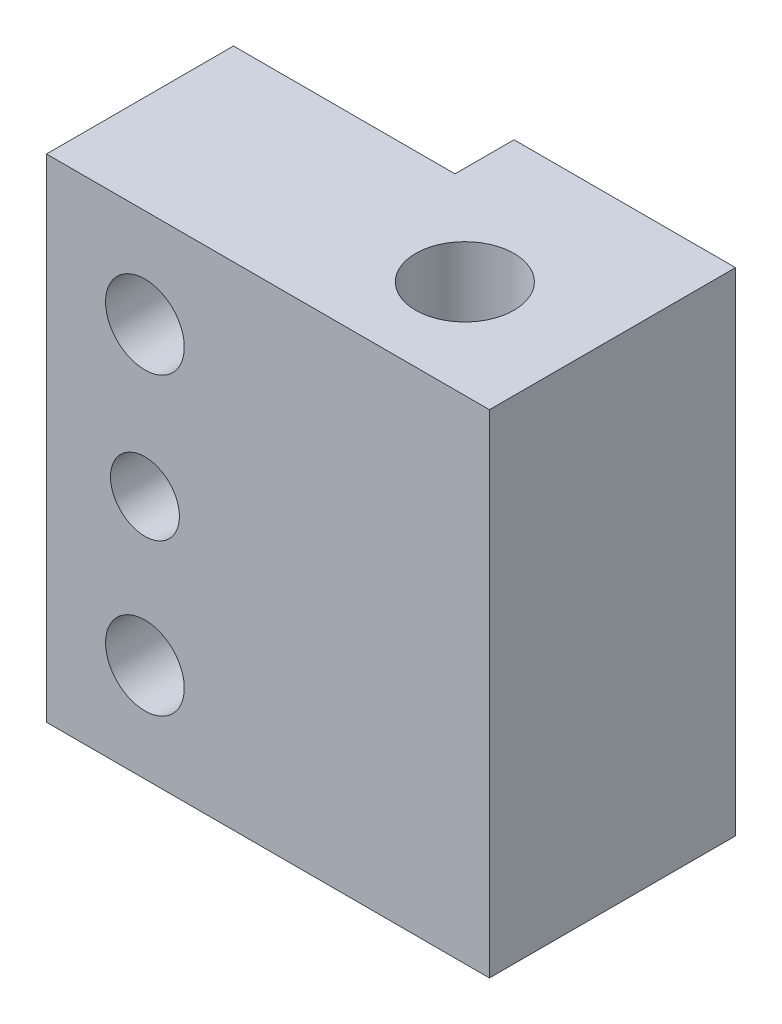
ISO-10303-21;
HEADER;
FILE_DESCRIPTION(('STEP AP214'),'2;1');
FILE_NAME('part.step','',(''),(''),'','','');
FILE_SCHEMA(('AUTOMOTIVE_DESIGN { 1 0 10303 214 1 1 1 1 }'));
ENDSEC;
DATA;
#1=APPLICATION_CONTEXT('core data for automotive mechanical design processes');
#2=APPLICATION_PROTOCOL_DEFINITION('international standard','automotive_design',2000,#1);
#3=PRODUCT_CONTEXT('',#1,'mechanical');
#4=PRODUCT('Part','Part','',(#3));
#5=PRODUCT_RELATED_PRODUCT_CATEGORY('part','',(#4));
#6=PRODUCT_DEFINITION_FORMATION('','',#4);
#7=PRODUCT_DEFINITION_CONTEXT('part definition',#1,'design');
#8=PRODUCT_DEFINITION('design','',#6,#7);
#9=PRODUCT_DEFINITION_SHAPE('','',#8);
#10=(LENGTH_UNIT() NAMED_UNIT(*) SI_UNIT(.MILLI.,.METRE.));
#11=(NAMED_UNIT(*) PLANE_ANGLE_UNIT() SI_UNIT($,.RADIAN.));
#12=(NAMED_UNIT(*) SI_UNIT($,.STERADIAN.) SOLID_ANGLE_UNIT());
#13=UNCERTAINTY_MEASURE_WITH_UNIT(LENGTH_MEASURE(1.E-05),#10,'distance_accuracy_value','');
#14=(GEOMETRIC_REPRESENTATION_CONTEXT(3) GLOBAL_UNCERTAINTY_ASSIGNED_CONTEXT((#13)) GLOBAL_UNIT_ASSIGNED_CONTEXT((#10,
#11,#12)) REPRESENTATION_CONTEXT('',''));
#15=CARTESIAN_POINT('',(0.,0.,0.));
#16=DIRECTION('',(0.,0.,1.));
#17=DIRECTION('',(1.,0.,0.));
#18=AXIS2_PLACEMENT_3D('',#15,#16,#17);
#19=CARTESIAN_POINT('',(0.,10.,0.));
#20=DIRECTION('',(0.,1.,0.));
#21=DIRECTION('',(0.,0.,1.));
#22=AXIS2_PLACEMENT_3D('',#19,#20,#21);
#23=PLANE('',#22);
#24=DIRECTION('',(0.,0.,-1.));
#25=VECTOR('',#24,1.);
#26=CARTESIAN_POINT('',(11.,10.,0.));
#27=LINE('',#26,#25);
#28=CARTESIAN_POINT('',(11.,10.,0.));
#29=VERTEX_POINT('',#28);
#30=CARTESIAN_POINT('',(11.,10.,-3.8));
#31=VERTEX_POINT('',#30);
#32=EDGE_CURVE('E48',#29,#31,#27,.T.);
#33=ORIENTED_EDGE('',*,*,#32,.F.);
#34=DIRECTION('',(1.,0.,0.));
#35=VECTOR('',#34,1.);
#36=CARTESIAN_POINT('',(0.,10.,0.));
#37=LINE('',#36,#35);
#38=CARTESIAN_POINT('',(20.,10.,0.));
#39=VERTEX_POINT('',#38);
#40=EDGE_CURVE('E84',#29,#39,#37,.T.);
#41=ORIENTED_EDGE('',*,*,#40,.T.);
#42=DIRECTION('',(0.,0.,-1.));
#43=VECTOR('',#42,1.);
#44=CARTESIAN_POINT('',(20.,10.,0.));
#45=LINE('',#44,#43);
#46=CARTESIAN_POINT('',(20.,10.,-5.));
#47=VERTEX_POINT('',#46);
#48=EDGE_CURVE('E114',#39,#47,#45,.T.);
#49=ORIENTED_EDGE('',*,*,#48,.T.);
#50=DIRECTION('',(-1.,0.,0.));
#51=VECTOR('',#50,1.);
#52=CARTESIAN_POINT('',(20.,10.,-5.));
#53=LINE('',#52,#51);
#54=CARTESIAN_POINT('',(15.5,10.,-5.));
#55=VERTEX_POINT('',#54);
#56=EDGE_CURVE('E130',#47,#55,#53,.T.);
#57=ORIENTED_EDGE('',*,*,#56,.T.);
#58=DIRECTION('',(0.,0.,1.));
#59=VECTOR('',#58,1.);
#60=CARTESIAN_POINT('',(15.5,10.,-5.));
#61=LINE('',#60,#59);
#62=CARTESIAN_POINT('',(15.5,10.,-3.8));
#63=VERTEX_POINT('',#62);
#64=EDGE_CURVE('E57',#55,#63,#61,.T.);
#65=ORIENTED_EDGE('',*,*,#64,.T.);
#66=DIRECTION('',(-1.,0.,0.));
#67=VECTOR('',#66,1.);
#68=CARTESIAN_POINT('',(0.,10.,-3.8));
#69=LINE('',#68,#67);
#70=EDGE_CURVE('E122',#63,#31,#69,.T.);
#71=ORIENTED_EDGE('',*,*,#70,.T.);
#72=EDGE_LOOP('',(#33,#41,#49,#57,#65,#71));
#73=FACE_BOUND('',#72,.T.);
#74=CARTESIAN_POINT('',(17.5,10.,-2.));
#75=DIRECTION('',(0.,1.,0.));
#76=DIRECTION('',(0.,0.,1.));
#77=AXIS2_PLACEMENT_3D('',#74,#75,#76);
#78=CIRCLE('',#77,1.);
#79=CARTESIAN_POINT('',(17.5,10.,-0.999999999999999));
#80=VERTEX_POINT('',#79);
#81=EDGE_CURVE('E137',#80,#80,#78,.T.);
#82=ORIENTED_EDGE('',*,*,#81,.F.);
#83=EDGE_LOOP('',(#82));
#84=FACE_BOUND('',#83,.T.);
#85=ADVANCED_FACE('F33',(#73,#84),#23,.T.);
#86=CARTESIAN_POINT('',(0.,0.,0.));
#87=DIRECTION('',(0.,1.,0.));
#88=DIRECTION('',(0.,0.,1.));
#89=AXIS2_PLACEMENT_3D('',#86,#87,#88);
#90=PLANE('',#89);
#91=DIRECTION('',(1.,0.,0.));
#92=VECTOR('',#91,1.);
#93=CARTESIAN_POINT('',(0.,0.,0.));
#94=LINE('',#93,#92);
#95=CARTESIAN_POINT('',(11.,0.,0.));
#96=VERTEX_POINT('',#95);
#97=CARTESIAN_POINT('',(20.,0.,0.));
#98=VERTEX_POINT('',#97);
#99=EDGE_CURVE('E109',#96,#98,#94,.T.);
#100=ORIENTED_EDGE('',*,*,#99,.F.);
#101=DIRECTION('',(0.,0.,-1.));
#102=VECTOR('',#101,1.);
#103=CARTESIAN_POINT('',(11.,0.,0.));
#104=LINE('',#103,#102);
#105=CARTESIAN_POINT('',(11.,0.,-3.8));
#106=VERTEX_POINT('',#105);
#107=EDGE_CURVE('E95',#96,#106,#104,.T.);
#108=ORIENTED_EDGE('',*,*,#107,.T.);
#109=DIRECTION('',(-1.,0.,0.));
#110=VECTOR('',#109,1.);
#111=CARTESIAN_POINT('',(0.,0.,-3.8));
#112=LINE('',#111,#110);
#113=CARTESIAN_POINT('',(15.5,0.,-3.8));
#114=VERTEX_POINT('',#113);
#115=EDGE_CURVE('E107',#114,#106,#112,.T.);
#116=ORIENTED_EDGE('',*,*,#115,.F.);
#117=DIRECTION('',(0.,0.,1.));
#118=VECTOR('',#117,1.);
#119=CARTESIAN_POINT('',(15.5,0.,-5.));
#120=LINE('',#119,#118);
#121=CARTESIAN_POINT('',(15.5,0.,-5.));
#122=VERTEX_POINT('',#121);
#123=EDGE_CURVE('E78',#122,#114,#120,.T.);
#124=ORIENTED_EDGE('',*,*,#123,.F.);
#125=DIRECTION('',(-1.,0.,0.));
#126=VECTOR('',#125,1.);
#127=CARTESIAN_POINT('',(20.,0.,-5.));
#128=LINE('',#127,#126);
#129=CARTESIAN_POINT('',(20.,0.,-5.));
#130=VERTEX_POINT('',#129);
#131=EDGE_CURVE('E116',#130,#122,#128,.T.);
#132=ORIENTED_EDGE('',*,*,#131,.F.);
#133=DIRECTION('',(0.,0.,-1.));
#134=VECTOR('',#133,1.);
#135=CARTESIAN_POINT('',(20.,0.,0.));
#136=LINE('',#135,#134);
#137=EDGE_CURVE('E133',#98,#130,#136,.T.);
#138=ORIENTED_EDGE('',*,*,#137,.F.);
#139=EDGE_LOOP('',(#100,#108,#116,#124,#132,#138));
#140=FACE_BOUND('',#139,.T.);
#141=CARTESIAN_POINT('',(17.5,0.,-2.));
#142=DIRECTION('',(0.,1.,0.));
#143=DIRECTION('',(0.,0.,1.));
#144=AXIS2_PLACEMENT_3D('',#141,#142,#143);
#145=CIRCLE('',#144,1.);
#146=CARTESIAN_POINT('',(17.5,0.,-0.999999999999999));
#147=VERTEX_POINT('',#146);
#148=EDGE_CURVE('E142',#147,#147,#145,.T.);
#149=ORIENTED_EDGE('',*,*,#148,.T.);
#150=EDGE_LOOP('',(#149));
#151=FACE_BOUND('',#150,.T.);
#152=ADVANCED_FACE('F105',(#140,#151),#90,.F.);
#153=CARTESIAN_POINT('',(0.,10.,0.));
#154=DIRECTION('',(0.,0.,-1.));
#155=DIRECTION('',(-1.,0.,0.));
#156=AXIS2_PLACEMENT_3D('',#153,#154,#155);
#157=PLANE('',#156);
#158=CARTESIAN_POINT('',(13.,2.,0.));
#159=DIRECTION('',(0.,0.,-1.));
#160=DIRECTION('',(-1.,0.,0.));
#161=AXIS2_PLACEMENT_3D('',#158,#159,#160);
#162=CIRCLE('',#161,0.800000000000001);
#163=CARTESIAN_POINT('',(12.2,2.,0.));
#164=VERTEX_POINT('',#163);
#165=EDGE_CURVE('E157',#164,#164,#162,.T.);
#166=ORIENTED_EDGE('',*,*,#165,.T.);
#167=EDGE_LOOP('',(#166));
#168=FACE_BOUND('',#167,.T.);
#169=CARTESIAN_POINT('',(13.,8.,0.));
#170=DIRECTION('',(0.,0.,-1.));
#171=DIRECTION('',(-1.,0.,0.));
#172=AXIS2_PLACEMENT_3D('',#169,#170,#171);
#173=CIRCLE('',#172,0.800000000000001);
#174=CARTESIAN_POINT('',(12.2,8.,0.));
#175=VERTEX_POINT('',#174);
#176=EDGE_CURVE('E151',#175,#175,#173,.T.);
#177=ORIENTED_EDGE('',*,*,#176,.T.);
#178=EDGE_LOOP('',(#177));
#179=FACE_BOUND('',#178,.T.);
#180=CARTESIAN_POINT('',(13.,4.97179419342608,0.));
#181=DIRECTION('',(0.,0.,-1.));
#182=DIRECTION('',(-1.,0.,0.));
#183=AXIS2_PLACEMENT_3D('',#180,#181,#182);
#184=CIRCLE('',#183,0.7);
#185=CARTESIAN_POINT('',(12.3,4.97179419342608,0.));
#186=VERTEX_POINT('',#185);
#187=EDGE_CURVE('E145',#186,#186,#184,.T.);
#188=ORIENTED_EDGE('',*,*,#187,.T.);
#189=EDGE_LOOP('',(#188));
#190=FACE_BOUND('',#189,.T.);
#191=ORIENTED_EDGE('',*,*,#40,.F.);
#192=DIRECTION('',(0.,-1.,0.));
#193=VECTOR('',#192,1.);
#194=CARTESIAN_POINT('',(11.,13.7260185185539,0.));
#195=LINE('',#194,#193);
#196=EDGE_CURVE('E100',#29,#96,#195,.T.);
#197=ORIENTED_EDGE('',*,*,#196,.T.);
#198=ORIENTED_EDGE('',*,*,#99,.T.);
#199=DIRECTION('',(0.,-1.,0.));
#200=VECTOR('',#199,1.);
#201=CARTESIAN_POINT('',(20.,10.,0.));
#202=LINE('',#201,#200);
#203=EDGE_CURVE('E11',#39,#98,#202,.T.);
#204=ORIENTED_EDGE('',*,*,#203,.F.);
#205=EDGE_LOOP('',(#191,#197,#198,#204));
#206=FACE_BOUND('',#205,.T.);
#207=ADVANCED_FACE('F35',(#168,#179,#190,#206),#157,.F.);
#208=CARTESIAN_POINT('',(20.,10.,0.));
#209=DIRECTION('',(-1.,0.,0.));
#210=DIRECTION('',(0.,0.,1.));
#211=AXIS2_PLACEMENT_3D('',#208,#209,#210);
#212=PLANE('',#211);
#213=ORIENTED_EDGE('',*,*,#137,.T.);
#214=DIRECTION('',(0.,-1.,0.));
#215=VECTOR('',#214,1.);
#216=CARTESIAN_POINT('',(20.,10.,-5.));
#217=LINE('',#216,#215);
#218=EDGE_CURVE('E41',#47,#130,#217,.T.);
#219=ORIENTED_EDGE('',*,*,#218,.F.);
#220=ORIENTED_EDGE('',*,*,#48,.F.);
#221=ORIENTED_EDGE('',*,*,#203,.T.);
#222=EDGE_LOOP('',(#213,#219,#220,#221));
#223=FACE_BOUND('',#222,.T.);
#224=ADVANCED_FACE('F183',(#223),#212,.F.);
#225=CARTESIAN_POINT('',(20.,10.,-5.));
#226=DIRECTION('',(0.,0.,1.));
#227=DIRECTION('',(1.,0.,0.));
#228=AXIS2_PLACEMENT_3D('',#225,#226,#227);
#229=PLANE('',#228);
#230=ORIENTED_EDGE('',*,*,#131,.T.);
#231=DIRECTION('',(0.,-1.,0.));
#232=VECTOR('',#231,1.);
#233=CARTESIAN_POINT('',(15.5,10.,-5.));
#234=LINE('',#233,#232);
#235=EDGE_CURVE('E121',#55,#122,#234,.T.);
#236=ORIENTED_EDGE('',*,*,#235,.F.);
#237=ORIENTED_EDGE('',*,*,#56,.F.);
#238=ORIENTED_EDGE('',*,*,#218,.T.);
#239=EDGE_LOOP('',(#230,#236,#237,#238));
#240=FACE_BOUND('',#239,.T.);
#241=ADVANCED_FACE('F128',(#240),#229,.F.);
#242=CARTESIAN_POINT('',(15.5,10.,-5.));
#243=DIRECTION('',(1.,0.,0.));
#244=DIRECTION('',(0.,0.,-1.));
#245=AXIS2_PLACEMENT_3D('',#242,#243,#244);
#246=PLANE('',#245);
#247=ORIENTED_EDGE('',*,*,#123,.T.);
#248=DIRECTION('',(0.,-1.,0.));
#249=VECTOR('',#248,1.);
#250=CARTESIAN_POINT('',(15.5,10.,-3.8));
#251=LINE('',#250,#249);
#252=EDGE_CURVE('E112',#63,#114,#251,.T.);
#253=ORIENTED_EDGE('',*,*,#252,.F.);
#254=ORIENTED_EDGE('',*,*,#64,.F.);
#255=ORIENTED_EDGE('',*,*,#235,.T.);
#256=EDGE_LOOP('',(#247,#253,#254,#255));
#257=FACE_BOUND('',#256,.T.);
#258=ADVANCED_FACE('F188',(#257),#246,.F.);
#259=CARTESIAN_POINT('',(0.,10.,-3.8));
#260=DIRECTION('',(0.,0.,1.));
#261=DIRECTION('',(1.,0.,0.));
#262=AXIS2_PLACEMENT_3D('',#259,#260,#261);
#263=PLANE('',#262);
#264=CARTESIAN_POINT('',(13.,2.,-3.8));
#265=DIRECTION('',(0.,0.,-1.));
#266=DIRECTION('',(-1.,0.,0.));
#267=AXIS2_PLACEMENT_3D('',#264,#265,#266);
#268=CIRCLE('',#267,0.800000000000001);
#269=CARTESIAN_POINT('',(12.2,2.,-3.8));
#270=VERTEX_POINT('',#269);
#271=EDGE_CURVE('E160',#270,#270,#268,.T.);
#272=ORIENTED_EDGE('',*,*,#271,.F.);
#273=EDGE_LOOP('',(#272));
#274=FACE_BOUND('',#273,.T.);
#275=CARTESIAN_POINT('',(13.,8.,-3.8));
#276=DIRECTION('',(0.,0.,-1.));
#277=DIRECTION('',(-1.,0.,0.));
#278=AXIS2_PLACEMENT_3D('',#275,#276,#277);
#279=CIRCLE('',#278,0.800000000000001);
#280=CARTESIAN_POINT('',(12.2,8.,-3.8));
#281=VERTEX_POINT('',#280);
#282=EDGE_CURVE('E154',#281,#281,#279,.T.);
#283=ORIENTED_EDGE('',*,*,#282,.F.);
#284=EDGE_LOOP('',(#283));
#285=FACE_BOUND('',#284,.T.);
#286=CARTESIAN_POINT('',(13.,4.97179419342608,-3.8));
#287=DIRECTION('',(0.,0.,-1.));
#288=DIRECTION('',(-1.,0.,0.));
#289=AXIS2_PLACEMENT_3D('',#286,#287,#288);
#290=CIRCLE('',#289,0.7);
#291=CARTESIAN_POINT('',(12.3,4.97179419342608,-3.8));
#292=VERTEX_POINT('',#291);
#293=EDGE_CURVE('E148',#292,#292,#290,.T.);
#294=ORIENTED_EDGE('',*,*,#293,.F.);
#295=EDGE_LOOP('',(#294));
#296=FACE_BOUND('',#295,.T.);
#297=ORIENTED_EDGE('',*,*,#115,.T.);
#298=DIRECTION('',(0.,-1.,0.));
#299=VECTOR('',#298,1.);
#300=CARTESIAN_POINT('',(11.,13.7260185185539,-3.8));
#301=LINE('',#300,#299);
#302=EDGE_CURVE('E92',#31,#106,#301,.T.);
#303=ORIENTED_EDGE('',*,*,#302,.F.);
#304=ORIENTED_EDGE('',*,*,#70,.F.);
#305=ORIENTED_EDGE('',*,*,#252,.T.);
#306=EDGE_LOOP('',(#297,#303,#304,#305));
#307=FACE_BOUND('',#306,.T.);
#308=ADVANCED_FACE('F111',(#274,#285,#296,#307),#263,.F.);
#309=CARTESIAN_POINT('',(17.5,10.,-2.));
#310=DIRECTION('',(0.,-1.,0.));
#311=DIRECTION('',(0.,0.,-1.));
#312=AXIS2_PLACEMENT_3D('',#309,#310,#311);
#313=CYLINDRICAL_SURFACE('',#312,1.);
#314=ORIENTED_EDGE('',*,*,#81,.T.);
#315=EDGE_LOOP('',(#314));
#316=FACE_BOUND('',#315,.T.);
#317=ORIENTED_EDGE('',*,*,#148,.F.);
#318=EDGE_LOOP('',(#317));
#319=FACE_BOUND('',#318,.T.);
#320=ADVANCED_FACE('F172',(#316,#319),#313,.F.);
#321=CARTESIAN_POINT('',(13.,4.97179419342608,0.));
#322=DIRECTION('',(0.,0.,-1.));
#323=DIRECTION('',(-1.,0.,0.));
#324=AXIS2_PLACEMENT_3D('',#321,#322,#323);
#325=CYLINDRICAL_SURFACE('',#324,0.7);
#326=CARTESIAN_POINT('',(12.3,4.97179419342608,0.));
#327=CARTESIAN_POINT('',(12.3,4.97179419342608,-0.0395833333333329));
#328=CARTESIAN_POINT('',(12.3,4.97179419342608,-0.0791666666666662));
#329=CARTESIAN_POINT('',(12.3,4.97179419342608,-0.158333333333333));
#330=CARTESIAN_POINT('',(12.3,4.97179419342608,-0.197916666666666));
#331=CARTESIAN_POINT('',(12.3,4.97179419342608,-0.277083333333333));
#332=CARTESIAN_POINT('',(12.3,4.97179419342608,-0.316666666666666));
#333=CARTESIAN_POINT('',(12.3,4.97179419342608,-0.395833333333333));
#334=CARTESIAN_POINT('',(12.3,4.97179419342608,-0.435416666666666));
#335=CARTESIAN_POINT('',(12.3,4.97179419342608,-0.514583333333333));
#336=CARTESIAN_POINT('',(12.3,4.97179419342608,-0.554166666666666));
#337=CARTESIAN_POINT('',(12.3,4.97179419342608,-0.633333333333333));
#338=CARTESIAN_POINT('',(12.3,4.97179419342608,-0.672916666666666));
#339=CARTESIAN_POINT('',(12.3,4.97179419342608,-0.752083333333333));
#340=CARTESIAN_POINT('',(12.3,4.97179419342608,-0.791666666666666));
#341=CARTESIAN_POINT('',(12.3,4.97179419342608,-0.870833333333333));
#342=CARTESIAN_POINT('',(12.3,4.97179419342608,-0.910416666666666));
#343=CARTESIAN_POINT('',(12.3,4.97179419342608,-0.989583333333333));
#344=CARTESIAN_POINT('',(12.3,4.97179419342608,-1.02916666666667));
#345=CARTESIAN_POINT('',(12.3,4.97179419342608,-1.10833333333333));
#346=CARTESIAN_POINT('',(12.3,4.97179419342608,-1.14791666666667));
#347=CARTESIAN_POINT('',(12.3,4.97179419342608,-1.22708333333333));
#348=CARTESIAN_POINT('',(12.3,4.97179419342608,-1.26666666666667));
#349=CARTESIAN_POINT('',(12.3,4.97179419342608,-1.34583333333333));
#350=CARTESIAN_POINT('',(12.3,4.97179419342608,-1.38541666666667));
#351=CARTESIAN_POINT('',(12.3,4.97179419342608,-1.46458333333333));
#352=CARTESIAN_POINT('',(12.3,4.97179419342608,-1.50416666666667));
#353=CARTESIAN_POINT('',(12.3,4.97179419342608,-1.58333333333333));
#354=CARTESIAN_POINT('',(12.3,4.97179419342608,-1.62291666666667));
#355=CARTESIAN_POINT('',(12.3,4.97179419342608,-1.70208333333333));
#356=CARTESIAN_POINT('',(12.3,4.97179419342608,-1.74166666666667));
#357=CARTESIAN_POINT('',(12.3,4.97179419342608,-1.82083333333333));
#358=CARTESIAN_POINT('',(12.3,4.97179419342608,-1.86041666666667));
#359=CARTESIAN_POINT('',(12.3,4.97179419342608,-1.93958333333333));
#360=CARTESIAN_POINT('',(12.3,4.97179419342608,-1.97916666666667));
#361=CARTESIAN_POINT('',(12.3,4.97179419342608,-2.05833333333333));
#362=CARTESIAN_POINT('',(12.3,4.97179419342608,-2.09791666666667));
#363=CARTESIAN_POINT('',(12.3,4.97179419342608,-2.17708333333333));
#364=CARTESIAN_POINT('',(12.3,4.97179419342608,-2.21666666666667));
#365=CARTESIAN_POINT('',(12.3,4.97179419342608,-2.29583333333333));
#366=CARTESIAN_POINT('',(12.3,4.97179419342608,-2.33541666666667));
#367=CARTESIAN_POINT('',(12.3,4.97179419342608,-2.41458333333333));
#368=CARTESIAN_POINT('',(12.3,4.97179419342608,-2.45416666666667));
#369=CARTESIAN_POINT('',(12.3,4.97179419342608,-2.53333333333333));
#370=CARTESIAN_POINT('',(12.3,4.97179419342608,-2.57291666666667));
#371=CARTESIAN_POINT('',(12.3,4.97179419342608,-2.65208333333333));
#372=CARTESIAN_POINT('',(12.3,4.97179419342608,-2.69166666666667));
#373=CARTESIAN_POINT('',(12.3,4.97179419342608,-2.77083333333333));
#374=CARTESIAN_POINT('',(12.3,4.97179419342608,-2.81041666666667));
#375=CARTESIAN_POINT('',(12.3,4.97179419342608,-2.88958333333333));
#376=CARTESIAN_POINT('',(12.3,4.97179419342608,-2.92916666666667));
#377=CARTESIAN_POINT('',(12.3,4.97179419342608,-3.00833333333333));
#378=CARTESIAN_POINT('',(12.3,4.97179419342608,-3.04791666666667));
#379=CARTESIAN_POINT('',(12.3,4.97179419342608,-3.12708333333333));
#380=CARTESIAN_POINT('',(12.3,4.97179419342608,-3.16666666666667));
#381=CARTESIAN_POINT('',(12.3,4.97179419342608,-3.24583333333333));
#382=CARTESIAN_POINT('',(12.3,4.97179419342608,-3.28541666666667));
#383=CARTESIAN_POINT('',(12.3,4.97179419342608,-3.36458333333333));
#384=CARTESIAN_POINT('',(12.3,4.97179419342608,-3.40416666666667));
#385=CARTESIAN_POINT('',(12.3,4.97179419342608,-3.48333333333333));
#386=CARTESIAN_POINT('',(12.3,4.97179419342608,-3.52291666666667));
#387=CARTESIAN_POINT('',(12.3,4.97179419342608,-3.60208333333333));
#388=CARTESIAN_POINT('',(12.3,4.97179419342608,-3.64166666666667));
#389=CARTESIAN_POINT('',(12.3,4.97179419342608,-3.72083333333333));
#390=CARTESIAN_POINT('',(12.3,4.97179419342608,-3.76041666666667));
#391=CARTESIAN_POINT('',(12.3,4.97179419342608,-3.8));
#392=B_SPLINE_CURVE_WITH_KNOTS('',3,(#326,#327,#328,#329,#330,#331,#332,#333,#334,#335,#336,
#337,#338,#339,#340,#341,#342,#343,#344,#345,#346,#347,#348,#349,#350,#351,#352,#353,#354,#355,
#356,#357,#358,#359,#360,#361,#362,#363,#364,#365,#366,#367,#368,#369,#370,#371,#372,#373,#374,
#375,#376,#377,#378,#379,#380,#381,#382,#383,#384,#385,#386,#387,#388,#389,#390,#391),
.UNSPECIFIED.,.F.,.F.,(4,2,2,2,2,2,2,2,2,2,2,2,2,2,2,2,2,2,2,2,2,2,2,2,2,2,2,2,2,2,2,2,4),(0.,
0.11875,0.2375,0.35625,0.475,0.59375,0.7125,0.83125,0.95,1.06875,1.1875,1.30625,1.425,1.54375,
1.6625,1.78125,1.9,2.01875,2.1375,2.25625,2.375,2.49375,2.6125,2.73125,2.85,2.96875,3.0875,
3.20625,3.325,3.44375,3.5625,3.68125,3.8),.UNSPECIFIED.);
#393=EDGE_CURVE('BSEAM175',#186,#292,#392,.T.);
#394=ORIENTED_EDGE('',*,*,#187,.F.);
#395=ORIENTED_EDGE('',*,*,#293,.T.);
#396=ORIENTED_EDGE('',*,*,#393,.T.);
#397=ORIENTED_EDGE('',*,*,#393,.F.);
#398=EDGE_LOOP('',(#394,#396,#395,#397));
#399=FACE_BOUND('',#398,.T.);
#400=ADVANCED_FACE('F175',(#399),#325,.F.);
#401=CARTESIAN_POINT('',(13.,8.,0.));
#402=DIRECTION('',(0.,0.,-1.));
#403=DIRECTION('',(-1.,0.,0.));
#404=AXIS2_PLACEMENT_3D('',#401,#402,#403);
#405=CYLINDRICAL_SURFACE('',#404,0.800000000000001);
#406=CARTESIAN_POINT('',(12.2,8.,0.));
#407=CARTESIAN_POINT('',(12.2,8.,-0.0395833333333329));
#408=CARTESIAN_POINT('',(12.2,8.,-0.0791666666666662));
#409=CARTESIAN_POINT('',(12.2,8.,-0.158333333333333));
#410=CARTESIAN_POINT('',(12.2,8.,-0.197916666666666));
#411=CARTESIAN_POINT('',(12.2,8.,-0.277083333333333));
#412=CARTESIAN_POINT('',(12.2,8.,-0.316666666666666));
#413=CARTESIAN_POINT('',(12.2,8.,-0.395833333333333));
#414=CARTESIAN_POINT('',(12.2,8.,-0.435416666666666));
#415=CARTESIAN_POINT('',(12.2,8.,-0.514583333333333));
#416=CARTESIAN_POINT('',(12.2,8.,-0.554166666666666));
#417=CARTESIAN_POINT('',(12.2,8.,-0.633333333333333));
#418=CARTESIAN_POINT('',(12.2,8.,-0.672916666666666));
#419=CARTESIAN_POINT('',(12.2,8.,-0.752083333333333));
#420=CARTESIAN_POINT('',(12.2,8.,-0.791666666666666));
#421=CARTESIAN_POINT('',(12.2,8.,-0.870833333333333));
#422=CARTESIAN_POINT('',(12.2,8.,-0.910416666666666));
#423=CARTESIAN_POINT('',(12.2,8.,-0.989583333333333));
#424=CARTESIAN_POINT('',(12.2,8.,-1.02916666666667));
#425=CARTESIAN_POINT('',(12.2,8.,-1.10833333333333));
#426=CARTESIAN_POINT('',(12.2,8.,-1.14791666666667));
#427=CARTESIAN_POINT('',(12.2,8.,-1.22708333333333));
#428=CARTESIAN_POINT('',(12.2,8.,-1.26666666666667));
#429=CARTESIAN_POINT('',(12.2,8.,-1.34583333333333));
#430=CARTESIAN_POINT('',(12.2,8.,-1.38541666666667));
#431=CARTESIAN_POINT('',(12.2,8.,-1.46458333333333));
#432=CARTESIAN_POINT('',(12.2,8.,-1.50416666666667));
#433=CARTESIAN_POINT('',(12.2,8.,-1.58333333333333));
#434=CARTESIAN_POINT('',(12.2,8.,-1.62291666666667));
#435=CARTESIAN_POINT('',(12.2,8.,-1.70208333333333));
#436=CARTESIAN_POINT('',(12.2,8.,-1.74166666666667));
#437=CARTESIAN_POINT('',(12.2,8.,-1.82083333333333));
#438=CARTESIAN_POINT('',(12.2,8.,-1.86041666666667));
#439=CARTESIAN_POINT('',(12.2,8.,-1.93958333333333));
#440=CARTESIAN_POINT('',(12.2,8.,-1.97916666666667));
#441=CARTESIAN_POINT('',(12.2,8.,-2.05833333333333));
#442=CARTESIAN_POINT('',(12.2,8.,-2.09791666666667));
#443=CARTESIAN_POINT('',(12.2,8.,-2.17708333333333));
#444=CARTESIAN_POINT('',(12.2,8.,-2.21666666666667));
#445=CARTESIAN_POINT('',(12.2,8.,-2.29583333333333));
#446=CARTESIAN_POINT('',(12.2,8.,-2.33541666666667));
#447=CARTESIAN_POINT('',(12.2,8.,-2.41458333333333));
#448=CARTESIAN_POINT('',(12.2,8.,-2.45416666666667));
#449=CARTESIAN_POINT('',(12.2,8.,-2.53333333333333));
#450=CARTESIAN_POINT('',(12.2,8.,-2.57291666666667));
#451=CARTESIAN_POINT('',(12.2,8.,-2.65208333333333));
#452=CARTESIAN_POINT('',(12.2,8.,-2.69166666666667));
#453=CARTESIAN_POINT('',(12.2,8.,-2.77083333333333));
#454=CARTESIAN_POINT('',(12.2,8.,-2.81041666666667));
#455=CARTESIAN_POINT('',(12.2,8.,-2.88958333333333));
#456=CARTESIAN_POINT('',(12.2,8.,-2.92916666666667));
#457=CARTESIAN_POINT('',(12.2,8.,-3.00833333333333));
#458=CARTESIAN_POINT('',(12.2,8.,-3.04791666666667));
#459=CARTESIAN_POINT('',(12.2,8.,-3.12708333333333));
#460=CARTESIAN_POINT('',(12.2,8.,-3.16666666666667));
#461=CARTESIAN_POINT('',(12.2,8.,-3.24583333333333));
#462=CARTESIAN_POINT('',(12.2,8.,-3.28541666666667));
#463=CARTESIAN_POINT('',(12.2,8.,-3.36458333333333));
#464=CARTESIAN_POINT('',(12.2,8.,-3.40416666666667));
#465=CARTESIAN_POINT('',(12.2,8.,-3.48333333333333));
#466=CARTESIAN_POINT('',(12.2,8.,-3.52291666666667));
#467=CARTESIAN_POINT('',(12.2,8.,-3.60208333333333));
#468=CARTESIAN_POINT('',(12.2,8.,-3.64166666666667));
#469=CARTESIAN_POINT('',(12.2,8.,-3.72083333333333));
#470=CARTESIAN_POINT('',(12.2,8.,-3.76041666666667));
#471=CARTESIAN_POINT('',(12.2,8.,-3.8));
#472=B_SPLINE_CURVE_WITH_KNOTS('',3,(#406,#407,#408,#409,#410,#411,#412,#413,#414,#415,#416,
#417,#418,#419,#420,#421,#422,#423,#424,#425,#426,#427,#428,#429,#430,#431,#432,#433,#434,#435,
#436,#437,#438,#439,#440,#441,#442,#443,#444,#445,#446,#447,#448,#449,#450,#451,#452,#453,#454,
#455,#456,#457,#458,#459,#460,#461,#462,#463,#464,#465,#466,#467,#468,#469,#470,#471),
.UNSPECIFIED.,.F.,.F.,(4,2,2,2,2,2,2,2,2,2,2,2,2,2,2,2,2,2,2,2,2,2,2,2,2,2,2,2,2,2,2,2,4),(0.,
0.11875,0.2375,0.35625,0.475,0.59375,0.7125,0.83125,0.95,1.06875,1.1875,1.30625,1.425,1.54375,
1.6625,1.78125,1.9,2.01875,2.1375,2.25625,2.375,2.49375,2.6125,2.73125,2.85,2.96875,3.0875,
3.20625,3.325,3.44375,3.5625,3.68125,3.8),.UNSPECIFIED.);
#473=EDGE_CURVE('BSEAM221',#175,#281,#472,.T.);
#474=ORIENTED_EDGE('',*,*,#176,.F.);
#475=ORIENTED_EDGE('',*,*,#282,.T.);
#476=ORIENTED_EDGE('',*,*,#473,.T.);
#477=ORIENTED_EDGE('',*,*,#473,.F.);
#478=EDGE_LOOP('',(#474,#476,#475,#477));
#479=FACE_BOUND('',#478,.T.);
#480=ADVANCED_FACE('F221',(#479),#405,.F.);
#481=CARTESIAN_POINT('',(13.,2.,0.));
#482=DIRECTION('',(0.,0.,-1.));
#483=DIRECTION('',(-1.,0.,0.));
#484=AXIS2_PLACEMENT_3D('',#481,#482,#483);
#485=CYLINDRICAL_SURFACE('',#484,0.800000000000001);
#486=CARTESIAN_POINT('',(12.2,2.,0.));
#487=CARTESIAN_POINT('',(12.2,2.,-0.0395833333333329));
#488=CARTESIAN_POINT('',(12.2,2.,-0.0791666666666662));
#489=CARTESIAN_POINT('',(12.2,2.,-0.158333333333333));
#490=CARTESIAN_POINT('',(12.2,2.,-0.197916666666666));
#491=CARTESIAN_POINT('',(12.2,2.,-0.277083333333333));
#492=CARTESIAN_POINT('',(12.2,2.,-0.316666666666666));
#493=CARTESIAN_POINT('',(12.2,2.,-0.395833333333333));
#494=CARTESIAN_POINT('',(12.2,2.,-0.435416666666666));
#495=CARTESIAN_POINT('',(12.2,2.,-0.514583333333333));
#496=CARTESIAN_POINT('',(12.2,2.,-0.554166666666666));
#497=CARTESIAN_POINT('',(12.2,2.,-0.633333333333333));
#498=CARTESIAN_POINT('',(12.2,2.,-0.672916666666666));
#499=CARTESIAN_POINT('',(12.2,2.,-0.752083333333333));
#500=CARTESIAN_POINT('',(12.2,2.,-0.791666666666666));
#501=CARTESIAN_POINT('',(12.2,2.,-0.870833333333333));
#502=CARTESIAN_POINT('',(12.2,2.,-0.910416666666666));
#503=CARTESIAN_POINT('',(12.2,2.,-0.989583333333333));
#504=CARTESIAN_POINT('',(12.2,2.,-1.02916666666667));
#505=CARTESIAN_POINT('',(12.2,2.,-1.10833333333333));
#506=CARTESIAN_POINT('',(12.2,2.,-1.14791666666667));
#507=CARTESIAN_POINT('',(12.2,2.,-1.22708333333333));
#508=CARTESIAN_POINT('',(12.2,2.,-1.26666666666667));
#509=CARTESIAN_POINT('',(12.2,2.,-1.34583333333333));
#510=CARTESIAN_POINT('',(12.2,2.,-1.38541666666667));
#511=CARTESIAN_POINT('',(12.2,2.,-1.46458333333333));
#512=CARTESIAN_POINT('',(12.2,2.,-1.50416666666667));
#513=CARTESIAN_POINT('',(12.2,2.,-1.58333333333333));
#514=CARTESIAN_POINT('',(12.2,2.,-1.62291666666667));
#515=CARTESIAN_POINT('',(12.2,2.,-1.70208333333333));
#516=CARTESIAN_POINT('',(12.2,2.,-1.74166666666667));
#517=CARTESIAN_POINT('',(12.2,2.,-1.82083333333333));
#518=CARTESIAN_POINT('',(12.2,2.,-1.86041666666667));
#519=CARTESIAN_POINT('',(12.2,2.,-1.93958333333333));
#520=CARTESIAN_POINT('',(12.2,2.,-1.97916666666667));
#521=CARTESIAN_POINT('',(12.2,2.,-2.05833333333333));
#522=CARTESIAN_POINT('',(12.2,2.,-2.09791666666667));
#523=CARTESIAN_POINT('',(12.2,2.,-2.17708333333333));
#524=CARTESIAN_POINT('',(12.2,2.,-2.21666666666667));
#525=CARTESIAN_POINT('',(12.2,2.,-2.29583333333333));
#526=CARTESIAN_POINT('',(12.2,2.,-2.33541666666667));
#527=CARTESIAN_POINT('',(12.2,2.,-2.41458333333333));
#528=CARTESIAN_POINT('',(12.2,2.,-2.45416666666667));
#529=CARTESIAN_POINT('',(12.2,2.,-2.53333333333333));
#530=CARTESIAN_POINT('',(12.2,2.,-2.57291666666667));
#531=CARTESIAN_POINT('',(12.2,2.,-2.65208333333333));
#532=CARTESIAN_POINT('',(12.2,2.,-2.69166666666667));
#533=CARTESIAN_POINT('',(12.2,2.,-2.77083333333333));
#534=CARTESIAN_POINT('',(12.2,2.,-2.81041666666667));
#535=CARTESIAN_POINT('',(12.2,2.,-2.88958333333333));
#536=CARTESIAN_POINT('',(12.2,2.,-2.92916666666667));
#537=CARTESIAN_POINT('',(12.2,2.,-3.00833333333333));
#538=CARTESIAN_POINT('',(12.2,2.,-3.04791666666667));
#539=CARTESIAN_POINT('',(12.2,2.,-3.12708333333333));
#540=CARTESIAN_POINT('',(12.2,2.,-3.16666666666667));
#541=CARTESIAN_POINT('',(12.2,2.,-3.24583333333333));
#542=CARTESIAN_POINT('',(12.2,2.,-3.28541666666667));
#543=CARTESIAN_POINT('',(12.2,2.,-3.36458333333333));
#544=CARTESIAN_POINT('',(12.2,2.,-3.40416666666667));
#545=CARTESIAN_POINT('',(12.2,2.,-3.48333333333333));
#546=CARTESIAN_POINT('',(12.2,2.,-3.52291666666667));
#547=CARTESIAN_POINT('',(12.2,2.,-3.60208333333333));
#548=CARTESIAN_POINT('',(12.2,2.,-3.64166666666667));
#549=CARTESIAN_POINT('',(12.2,2.,-3.72083333333333));
#550=CARTESIAN_POINT('',(12.2,2.,-3.76041666666667));
#551=CARTESIAN_POINT('',(12.2,2.,-3.8));
#552=B_SPLINE_CURVE_WITH_KNOTS('',3,(#486,#487,#488,#489,#490,#491,#492,#493,#494,#495,#496,
#497,#498,#499,#500,#501,#502,#503,#504,#505,#506,#507,#508,#509,#510,#511,#512,#513,#514,#515,
#516,#517,#518,#519,#520,#521,#522,#523,#524,#525,#526,#527,#528,#529,#530,#531,#532,#533,#534,
#535,#536,#537,#538,#539,#540,#541,#542,#543,#544,#545,#546,#547,#548,#549,#550,#551),
.UNSPECIFIED.,.F.,.F.,(4,2,2,2,2,2,2,2,2,2,2,2,2,2,2,2,2,2,2,2,2,2,2,2,2,2,2,2,2,2,2,2,4),(0.,
0.11875,0.2375,0.35625,0.475,0.59375,0.7125,0.83125,0.95,1.06875,1.1875,1.30625,1.425,1.54375,
1.6625,1.78125,1.9,2.01875,2.1375,2.25625,2.375,2.49375,2.6125,2.73125,2.85,2.96875,3.0875,
3.20625,3.325,3.44375,3.5625,3.68125,3.8),.UNSPECIFIED.);
#553=EDGE_CURVE('BSEAM229',#164,#270,#552,.T.);
#554=ORIENTED_EDGE('',*,*,#165,.F.);
#555=ORIENTED_EDGE('',*,*,#271,.T.);
#556=ORIENTED_EDGE('',*,*,#553,.T.);
#557=ORIENTED_EDGE('',*,*,#553,.F.);
#558=EDGE_LOOP('',(#554,#556,#555,#557));
#559=FACE_BOUND('',#558,.T.);
#560=ADVANCED_FACE('F229',(#559),#485,.F.);
#561=CARTESIAN_POINT('',(11.,13.7260185185539,0.));
#562=DIRECTION('',(1.,0.,0.));
#563=DIRECTION('',(0.,1.,0.));
#564=AXIS2_PLACEMENT_3D('',#561,#562,#563);
#565=PLANE('',#564);
#566=ORIENTED_EDGE('',*,*,#32,.T.);
#567=ORIENTED_EDGE('',*,*,#302,.T.);
#568=ORIENTED_EDGE('',*,*,#107,.F.);
#569=ORIENTED_EDGE('',*,*,#196,.F.);
#570=EDGE_LOOP('',(#566,#567,#568,#569));
#571=FACE_BOUND('',#570,.T.);
#572=ADVANCED_FACE('F94',(#571),#565,.F.);
#573=CLOSED_SHELL('',(#85,#152,#207,#224,#241,#258,#308,#320,#400,#480,#560,#572));
#574=MANIFOLD_SOLID_BREP('B2',#573);
#575=ADVANCED_BREP_SHAPE_REPRESENTATION('',(#18,#574),#14);
#576=SHAPE_DEFINITION_REPRESENTATION(#9,#575);
ENDSEC;
END-ISO-10303-21;
